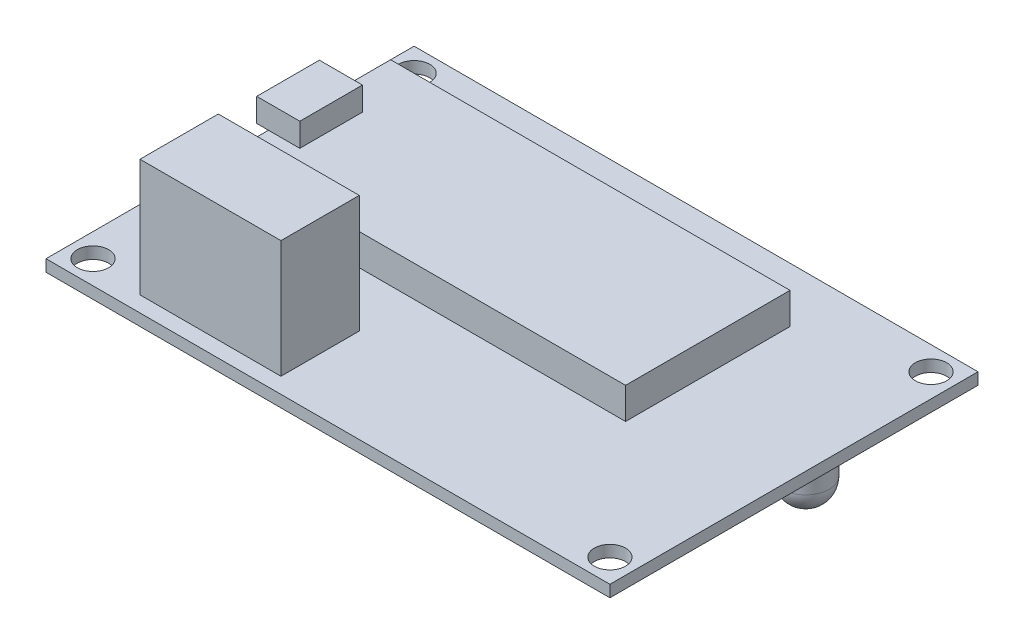
ISO-10303-21;
HEADER;
FILE_DESCRIPTION(('STEP AP214'),'2;1');
FILE_NAME('part.step','',(''),(''),'','','');
FILE_SCHEMA(('AUTOMOTIVE_DESIGN { 1 0 10303 214 1 1 1 1 }'));
ENDSEC;
DATA;
#1=APPLICATION_CONTEXT('core data for automotive mechanical design processes');
#2=APPLICATION_PROTOCOL_DEFINITION('international standard','automotive_design',2000,#1);
#3=PRODUCT_CONTEXT('',#1,'mechanical');
#4=PRODUCT('Part','Part','',(#3));
#5=PRODUCT_RELATED_PRODUCT_CATEGORY('part','',(#4));
#6=PRODUCT_DEFINITION_FORMATION('','',#4);
#7=PRODUCT_DEFINITION_CONTEXT('part definition',#1,'design');
#8=PRODUCT_DEFINITION('design','',#6,#7);
#9=PRODUCT_DEFINITION_SHAPE('','',#8);
#10=(LENGTH_UNIT() NAMED_UNIT(*) SI_UNIT(.MILLI.,.METRE.));
#11=(NAMED_UNIT(*) PLANE_ANGLE_UNIT() SI_UNIT($,.RADIAN.));
#12=(NAMED_UNIT(*) SI_UNIT($,.STERADIAN.) SOLID_ANGLE_UNIT());
#13=UNCERTAINTY_MEASURE_WITH_UNIT(LENGTH_MEASURE(1.E-05),#10,'distance_accuracy_value','');
#14=(GEOMETRIC_REPRESENTATION_CONTEXT(3) GLOBAL_UNCERTAINTY_ASSIGNED_CONTEXT((#13)) GLOBAL_UNIT_ASSIGNED_CONTEXT((#10,
#11,#12)) REPRESENTATION_CONTEXT('',''));
#15=CARTESIAN_POINT('',(0.,0.,0.));
#16=DIRECTION('',(0.,0.,1.));
#17=DIRECTION('',(1.,0.,0.));
#18=AXIS2_PLACEMENT_3D('',#15,#16,#17);
#19=CARTESIAN_POINT('',(0.,5.5,0.));
#20=DIRECTION('',(0.,-1.,0.));
#21=DIRECTION('',(0.,0.,-1.));
#22=AXIS2_PLACEMENT_3D('',#19,#20,#21);
#23=PLANE('',#22);
#24=DIRECTION('',(1.,0.,0.));
#25=VECTOR('',#24,1.);
#26=CARTESIAN_POINT('',(8.,5.5,-24.4062252079966));
#27=LINE('',#26,#25);
#28=CARTESIAN_POINT('',(4.,5.5,-24.4062252079966));
#29=VERTEX_POINT('',#28);
#30=CARTESIAN_POINT('',(8.,5.5,-24.4062252079966));
#31=VERTEX_POINT('',#30);
#32=EDGE_CURVE('E60',#29,#31,#27,.T.);
#33=ORIENTED_EDGE('',*,*,#32,.F.);
#34=DIRECTION('',(0.,0.,1.));
#35=VECTOR('',#34,1.);
#36=CARTESIAN_POINT('',(4.,5.5,-19.));
#37=LINE('',#36,#35);
#38=CARTESIAN_POINT('',(4.,5.5,-19.));
#39=VERTEX_POINT('',#38);
#40=EDGE_CURVE('E210',#29,#39,#37,.T.);
#41=ORIENTED_EDGE('',*,*,#40,.T.);
#42=DIRECTION('',(1.,0.,0.));
#43=VECTOR('',#42,1.);
#44=CARTESIAN_POINT('',(4.,5.5,-19.));
#45=LINE('',#44,#43);
#46=CARTESIAN_POINT('',(55.,5.5,-19.));
#47=VERTEX_POINT('',#46);
#48=EDGE_CURVE('E208',#39,#47,#45,.T.);
#49=ORIENTED_EDGE('',*,*,#48,.T.);
#50=DIRECTION('',(0.,0.,-1.));
#51=VECTOR('',#50,1.);
#52=CARTESIAN_POINT('',(55.,5.5,-19.));
#53=LINE('',#52,#51);
#54=CARTESIAN_POINT('',(55.,5.5,-40.));
#55=VERTEX_POINT('',#54);
#56=EDGE_CURVE('E213',#47,#55,#53,.T.);
#57=ORIENTED_EDGE('',*,*,#56,.T.);
#58=DIRECTION('',(-1.,0.,0.));
#59=VECTOR('',#58,1.);
#60=CARTESIAN_POINT('',(4.,5.5,-40.));
#61=LINE('',#60,#59);
#62=CARTESIAN_POINT('',(4.,5.5,-40.));
#63=VERTEX_POINT('',#62);
#64=EDGE_CURVE('E216',#55,#63,#61,.T.);
#65=ORIENTED_EDGE('',*,*,#64,.T.);
#66=CARTESIAN_POINT('',(4.,5.5,-32.4062252079966));
#67=VERTEX_POINT('',#66);
#68=EDGE_CURVE('E205',#63,#67,#37,.T.);
#69=ORIENTED_EDGE('',*,*,#68,.T.);
#70=DIRECTION('',(-1.,0.,0.));
#71=VECTOR('',#70,1.);
#72=CARTESIAN_POINT('',(8.,5.5,-32.4062252079966));
#73=LINE('',#72,#71);
#74=CARTESIAN_POINT('',(8.,5.5,-32.4062252079966));
#75=VERTEX_POINT('',#74);
#76=EDGE_CURVE('E72',#75,#67,#73,.T.);
#77=ORIENTED_EDGE('',*,*,#76,.F.);
#78=DIRECTION('',(0.,0.,-1.));
#79=VECTOR('',#78,1.);
#80=CARTESIAN_POINT('',(8.,5.5,-32.4062252079966));
#81=LINE('',#80,#79);
#82=EDGE_CURVE('E67',#31,#75,#81,.T.);
#83=ORIENTED_EDGE('',*,*,#82,.F.);
#84=EDGE_LOOP('',(#33,#41,#49,#57,#65,#69,#77,#83));
#85=FACE_BOUND('',#84,.T.);
#86=ADVANCED_FACE('F51',(#85),#23,.F.);
#87=CARTESIAN_POINT('',(0.,1.5,0.));
#88=DIRECTION('',(0.,-1.,0.));
#89=DIRECTION('',(0.,0.,-1.));
#90=AXIS2_PLACEMENT_3D('',#87,#88,#89);
#91=PLANE('',#90);
#92=DIRECTION('',(0.,0.,1.));
#93=VECTOR('',#92,1.);
#94=CARTESIAN_POINT('',(10.,1.5,-2.));
#95=LINE('',#94,#93);
#96=CARTESIAN_POINT('',(10.,1.5,-12.));
#97=VERTEX_POINT('',#96);
#98=CARTESIAN_POINT('',(10.,1.5,-2.));
#99=VERTEX_POINT('',#98);
#100=EDGE_CURVE('E246',#97,#99,#95,.T.);
#101=ORIENTED_EDGE('',*,*,#100,.F.);
#102=DIRECTION('',(-1.,0.,0.));
#103=VECTOR('',#102,1.);
#104=CARTESIAN_POINT('',(10.,1.5,-12.));
#105=LINE('',#104,#103);
#106=CARTESIAN_POINT('',(28.,1.5,-12.));
#107=VERTEX_POINT('',#106);
#108=EDGE_CURVE('E252',#107,#97,#105,.T.);
#109=ORIENTED_EDGE('',*,*,#108,.F.);
#110=DIRECTION('',(0.,0.,-1.));
#111=VECTOR('',#110,1.);
#112=CARTESIAN_POINT('',(28.,1.5,-2.));
#113=LINE('',#112,#111);
#114=CARTESIAN_POINT('',(28.,1.5,-2.));
#115=VERTEX_POINT('',#114);
#116=EDGE_CURVE('E269',#115,#107,#113,.T.);
#117=ORIENTED_EDGE('',*,*,#116,.F.);
#118=DIRECTION('',(1.,0.,0.));
#119=VECTOR('',#118,1.);
#120=CARTESIAN_POINT('',(10.,1.5,-2.));
#121=LINE('',#120,#119);
#122=EDGE_CURVE('E265',#99,#115,#121,.T.);
#123=ORIENTED_EDGE('',*,*,#122,.F.);
#124=EDGE_LOOP('',(#101,#109,#117,#123));
#125=FACE_BOUND('',#124,.T.);
#126=CARTESIAN_POINT('',(2.99999999999999,1.5,-44.));
#127=DIRECTION('',(0.,1.,0.));
#128=DIRECTION('',(0.,0.,1.));
#129=AXIS2_PLACEMENT_3D('',#126,#127,#128);
#130=CIRCLE('',#129,2.);
#131=CARTESIAN_POINT('',(2.99999999999999,1.5,-42.));
#132=VERTEX_POINT('',#131);
#133=EDGE_CURVE('E291',#132,#132,#130,.T.);
#134=ORIENTED_EDGE('',*,*,#133,.F.);
#135=EDGE_LOOP('',(#134));
#136=FACE_BOUND('',#135,.T.);
#137=CARTESIAN_POINT('',(2.99999999999999,1.5,-3.));
#138=DIRECTION('',(0.,1.,0.));
#139=DIRECTION('',(0.,0.,1.));
#140=AXIS2_PLACEMENT_3D('',#137,#138,#139);
#141=CIRCLE('',#140,2.);
#142=CARTESIAN_POINT('',(2.99999999999999,1.5,-0.999999999999995));
#143=VERTEX_POINT('',#142);
#144=EDGE_CURVE('E305',#143,#143,#141,.T.);
#145=ORIENTED_EDGE('',*,*,#144,.F.);
#146=EDGE_LOOP('',(#145));
#147=FACE_BOUND('',#146,.T.);
#148=CARTESIAN_POINT('',(69.,1.5,-3.));
#149=DIRECTION('',(0.,1.,0.));
#150=DIRECTION('',(0.,0.,1.));
#151=AXIS2_PLACEMENT_3D('',#148,#149,#150);
#152=CIRCLE('',#151,2.);
#153=CARTESIAN_POINT('',(69.,1.5,-1.));
#154=VERTEX_POINT('',#153);
#155=EDGE_CURVE('E297',#154,#154,#152,.T.);
#156=ORIENTED_EDGE('',*,*,#155,.F.);
#157=EDGE_LOOP('',(#156));
#158=FACE_BOUND('',#157,.T.);
#159=CARTESIAN_POINT('',(69.,1.5,-44.));
#160=DIRECTION('',(0.,1.,0.));
#161=DIRECTION('',(0.,0.,1.));
#162=AXIS2_PLACEMENT_3D('',#159,#160,#161);
#163=CIRCLE('',#162,2.);
#164=CARTESIAN_POINT('',(69.,1.5,-42.));
#165=VERTEX_POINT('',#164);
#166=EDGE_CURVE('E296',#165,#165,#163,.T.);
#167=ORIENTED_EDGE('',*,*,#166,.F.);
#168=EDGE_LOOP('',(#167));
#169=FACE_BOUND('',#168,.T.);
#170=DIRECTION('',(0.,0.,1.));
#171=VECTOR('',#170,1.);
#172=CARTESIAN_POINT('',(0.,1.5,0.));
#173=LINE('',#172,#171);
#174=CARTESIAN_POINT('',(0.,1.5,-47.));
#175=VERTEX_POINT('',#174);
#176=CARTESIAN_POINT('',(0.,1.5,0.));
#177=VERTEX_POINT('',#176);
#178=EDGE_CURVE('E324',#175,#177,#173,.T.);
#179=ORIENTED_EDGE('',*,*,#178,.T.);
#180=DIRECTION('',(1.,0.,0.));
#181=VECTOR('',#180,1.);
#182=CARTESIAN_POINT('',(0.,1.5,0.));
#183=LINE('',#182,#181);
#184=CARTESIAN_POINT('',(72.,1.5,0.));
#185=VERTEX_POINT('',#184);
#186=EDGE_CURVE('E328',#177,#185,#183,.T.);
#187=ORIENTED_EDGE('',*,*,#186,.T.);
#188=DIRECTION('',(0.,0.,-1.));
#189=VECTOR('',#188,1.);
#190=CARTESIAN_POINT('',(72.,1.5,0.));
#191=LINE('',#190,#189);
#192=CARTESIAN_POINT('',(72.,1.5,-47.));
#193=VERTEX_POINT('',#192);
#194=EDGE_CURVE('E332',#185,#193,#191,.T.);
#195=ORIENTED_EDGE('',*,*,#194,.T.);
#196=DIRECTION('',(-1.,0.,0.));
#197=VECTOR('',#196,1.);
#198=CARTESIAN_POINT('',(0.,1.5,-47.));
#199=LINE('',#198,#197);
#200=EDGE_CURVE('E335',#193,#175,#199,.T.);
#201=ORIENTED_EDGE('',*,*,#200,.T.);
#202=EDGE_LOOP('',(#179,#187,#195,#201));
#203=FACE_BOUND('',#202,.T.);
#204=DIRECTION('',(0.,0.,1.));
#205=VECTOR('',#204,1.);
#206=CARTESIAN_POINT('',(4.,1.5,-19.));
#207=LINE('',#206,#205);
#208=CARTESIAN_POINT('',(4.,1.5,-40.));
#209=VERTEX_POINT('',#208);
#210=CARTESIAN_POINT('',(4.,1.5,-19.));
#211=VERTEX_POINT('',#210);
#212=EDGE_CURVE('E194',#209,#211,#207,.T.);
#213=ORIENTED_EDGE('',*,*,#212,.F.);
#214=DIRECTION('',(-1.,0.,0.));
#215=VECTOR('',#214,1.);
#216=CARTESIAN_POINT('',(4.,1.5,-40.));
#217=LINE('',#216,#215);
#218=CARTESIAN_POINT('',(55.,1.5,-40.));
#219=VERTEX_POINT('',#218);
#220=EDGE_CURVE('E227',#219,#209,#217,.T.);
#221=ORIENTED_EDGE('',*,*,#220,.F.);
#222=DIRECTION('',(0.,0.,-1.));
#223=VECTOR('',#222,1.);
#224=CARTESIAN_POINT('',(55.,1.5,-19.));
#225=LINE('',#224,#223);
#226=CARTESIAN_POINT('',(55.,1.5,-19.));
#227=VERTEX_POINT('',#226);
#228=EDGE_CURVE('E223',#227,#219,#225,.T.);
#229=ORIENTED_EDGE('',*,*,#228,.F.);
#230=DIRECTION('',(1.,0.,0.));
#231=VECTOR('',#230,1.);
#232=CARTESIAN_POINT('',(4.,1.5,-19.));
#233=LINE('',#232,#231);
#234=EDGE_CURVE('E199',#211,#227,#233,.T.);
#235=ORIENTED_EDGE('',*,*,#234,.F.);
#236=EDGE_LOOP('',(#213,#221,#229,#235));
#237=FACE_BOUND('',#236,.T.);
#238=ADVANCED_FACE('F427',(#125,#136,#147,#158,#169,#203,#237),#91,.F.);
#239=CARTESIAN_POINT('',(0.,1.5,0.));
#240=DIRECTION('',(1.,0.,0.));
#241=DIRECTION('',(0.,0.,-1.));
#242=AXIS2_PLACEMENT_3D('',#239,#240,#241);
#243=PLANE('',#242);
#244=DIRECTION('',(0.,0.,1.));
#245=VECTOR('',#244,1.);
#246=CARTESIAN_POINT('',(0.,0.,0.));
#247=LINE('',#246,#245);
#248=CARTESIAN_POINT('',(0.,0.,-47.));
#249=VERTEX_POINT('',#248);
#250=CARTESIAN_POINT('',(0.,0.,0.));
#251=VERTEX_POINT('',#250);
#252=EDGE_CURVE('E320',#249,#251,#247,.T.);
#253=ORIENTED_EDGE('',*,*,#252,.T.);
#254=DIRECTION('',(0.,-1.,0.));
#255=VECTOR('',#254,1.);
#256=CARTESIAN_POINT('',(0.,1.5,0.));
#257=LINE('',#256,#255);
#258=EDGE_CURVE('E360',#177,#251,#257,.T.);
#259=ORIENTED_EDGE('',*,*,#258,.F.);
#260=ORIENTED_EDGE('',*,*,#178,.F.);
#261=DIRECTION('',(0.,-1.,0.));
#262=VECTOR('',#261,1.);
#263=CARTESIAN_POINT('',(0.,1.5,-47.));
#264=LINE('',#263,#262);
#265=EDGE_CURVE('E338',#175,#249,#264,.T.);
#266=ORIENTED_EDGE('',*,*,#265,.T.);
#267=EDGE_LOOP('',(#253,#259,#260,#266));
#268=FACE_BOUND('',#267,.T.);
#269=ADVANCED_FACE('F415',(#268),#243,.F.);
#270=CARTESIAN_POINT('',(0.,1.5,0.));
#271=DIRECTION('',(0.,0.,-1.));
#272=DIRECTION('',(-1.,0.,0.));
#273=AXIS2_PLACEMENT_3D('',#270,#271,#272);
#274=PLANE('',#273);
#275=DIRECTION('',(1.,0.,0.));
#276=VECTOR('',#275,1.);
#277=CARTESIAN_POINT('',(0.,0.,0.));
#278=LINE('',#277,#276);
#279=CARTESIAN_POINT('',(72.,0.,0.));
#280=VERTEX_POINT('',#279);
#281=EDGE_CURVE('E342',#251,#280,#278,.T.);
#282=ORIENTED_EDGE('',*,*,#281,.T.);
#283=DIRECTION('',(0.,-1.,0.));
#284=VECTOR('',#283,1.);
#285=CARTESIAN_POINT('',(72.,1.5,0.));
#286=LINE('',#285,#284);
#287=EDGE_CURVE('E357',#185,#280,#286,.T.);
#288=ORIENTED_EDGE('',*,*,#287,.F.);
#289=ORIENTED_EDGE('',*,*,#186,.F.);
#290=ORIENTED_EDGE('',*,*,#258,.T.);
#291=EDGE_LOOP('',(#282,#288,#289,#290));
#292=FACE_BOUND('',#291,.T.);
#293=ADVANCED_FACE('F425',(#292),#274,.F.);
#294=CARTESIAN_POINT('',(72.,1.5,0.));
#295=DIRECTION('',(-1.,0.,0.));
#296=DIRECTION('',(0.,0.,1.));
#297=AXIS2_PLACEMENT_3D('',#294,#295,#296);
#298=PLANE('',#297);
#299=DIRECTION('',(0.,0.,-1.));
#300=VECTOR('',#299,1.);
#301=CARTESIAN_POINT('',(72.,0.,0.));
#302=LINE('',#301,#300);
#303=CARTESIAN_POINT('',(72.,0.,-47.));
#304=VERTEX_POINT('',#303);
#305=EDGE_CURVE('E345',#280,#304,#302,.T.);
#306=ORIENTED_EDGE('',*,*,#305,.T.);
#307=DIRECTION('',(0.,-1.,0.));
#308=VECTOR('',#307,1.);
#309=CARTESIAN_POINT('',(72.,1.5,-47.));
#310=LINE('',#309,#308);
#311=EDGE_CURVE('E353',#193,#304,#310,.T.);
#312=ORIENTED_EDGE('',*,*,#311,.F.);
#313=ORIENTED_EDGE('',*,*,#194,.F.);
#314=ORIENTED_EDGE('',*,*,#287,.T.);
#315=EDGE_LOOP('',(#306,#312,#313,#314));
#316=FACE_BOUND('',#315,.T.);
#317=ADVANCED_FACE('F423',(#316),#298,.F.);
#318=CARTESIAN_POINT('',(0.,1.5,-47.));
#319=DIRECTION('',(0.,0.,1.));
#320=DIRECTION('',(1.,0.,0.));
#321=AXIS2_PLACEMENT_3D('',#318,#319,#320);
#322=PLANE('',#321);
#323=DIRECTION('',(-1.,0.,0.));
#324=VECTOR('',#323,1.);
#325=CARTESIAN_POINT('',(0.,0.,-47.));
#326=LINE('',#325,#324);
#327=EDGE_CURVE('E329',#304,#249,#326,.T.);
#328=ORIENTED_EDGE('',*,*,#327,.T.);
#329=ORIENTED_EDGE('',*,*,#265,.F.);
#330=ORIENTED_EDGE('',*,*,#200,.F.);
#331=ORIENTED_EDGE('',*,*,#311,.T.);
#332=EDGE_LOOP('',(#328,#329,#330,#331));
#333=FACE_BOUND('',#332,.T.);
#334=ADVANCED_FACE('F401',(#333),#322,.F.);
#335=CARTESIAN_POINT('',(0.,0.,0.));
#336=DIRECTION('',(0.,-1.,0.));
#337=DIRECTION('',(0.,0.,-1.));
#338=AXIS2_PLACEMENT_3D('',#335,#336,#337);
#339=PLANE('',#338);
#340=CARTESIAN_POINT('',(58.,0.,-39.));
#341=DIRECTION('',(0.,-1.,0.));
#342=DIRECTION('',(0.,0.,-1.));
#343=AXIS2_PLACEMENT_3D('',#340,#341,#342);
#344=CIRCLE('',#343,3.);
#345=CARTESIAN_POINT('',(58.,0.,-42.));
#346=VERTEX_POINT('',#345);
#347=EDGE_CURVE('E385',#346,#346,#344,.T.);
#348=ORIENTED_EDGE('',*,*,#347,.F.);
#349=EDGE_LOOP('',(#348));
#350=FACE_BOUND('',#349,.T.);
#351=CARTESIAN_POINT('',(2.99999999999999,0.,-44.));
#352=DIRECTION('',(0.,1.,0.));
#353=DIRECTION('',(0.,0.,1.));
#354=AXIS2_PLACEMENT_3D('',#351,#352,#353);
#355=CIRCLE('',#354,2.);
#356=CARTESIAN_POINT('',(2.99999999999999,0.,-42.));
#357=VERTEX_POINT('',#356);
#358=EDGE_CURVE('E309',#357,#357,#355,.T.);
#359=ORIENTED_EDGE('',*,*,#358,.T.);
#360=EDGE_LOOP('',(#359));
#361=FACE_BOUND('',#360,.T.);
#362=CARTESIAN_POINT('',(2.99999999999999,0.,-3.));
#363=DIRECTION('',(0.,1.,0.));
#364=DIRECTION('',(0.,0.,1.));
#365=AXIS2_PLACEMENT_3D('',#362,#363,#364);
#366=CIRCLE('',#365,2.);
#367=CARTESIAN_POINT('',(2.99999999999999,0.,-0.999999999999995));
#368=VERTEX_POINT('',#367);
#369=EDGE_CURVE('E301',#368,#368,#366,.T.);
#370=ORIENTED_EDGE('',*,*,#369,.T.);
#371=EDGE_LOOP('',(#370));
#372=FACE_BOUND('',#371,.T.);
#373=CARTESIAN_POINT('',(69.,0.,-3.));
#374=DIRECTION('',(0.,1.,0.));
#375=DIRECTION('',(0.,0.,1.));
#376=AXIS2_PLACEMENT_3D('',#373,#374,#375);
#377=CIRCLE('',#376,2.);
#378=CARTESIAN_POINT('',(69.,0.,-1.));
#379=VERTEX_POINT('',#378);
#380=EDGE_CURVE('E292',#379,#379,#377,.T.);
#381=ORIENTED_EDGE('',*,*,#380,.T.);
#382=EDGE_LOOP('',(#381));
#383=FACE_BOUND('',#382,.T.);
#384=CARTESIAN_POINT('',(69.,0.,-44.));
#385=DIRECTION('',(0.,1.,0.));
#386=DIRECTION('',(0.,0.,1.));
#387=AXIS2_PLACEMENT_3D('',#384,#385,#386);
#388=CIRCLE('',#387,2.);
#389=CARTESIAN_POINT('',(69.,0.,-42.));
#390=VERTEX_POINT('',#389);
#391=EDGE_CURVE('E316',#390,#390,#388,.T.);
#392=ORIENTED_EDGE('',*,*,#391,.T.);
#393=EDGE_LOOP('',(#392));
#394=FACE_BOUND('',#393,.T.);
#395=ORIENTED_EDGE('',*,*,#252,.F.);
#396=ORIENTED_EDGE('',*,*,#327,.F.);
#397=ORIENTED_EDGE('',*,*,#305,.F.);
#398=ORIENTED_EDGE('',*,*,#281,.F.);
#399=EDGE_LOOP('',(#395,#396,#397,#398));
#400=FACE_BOUND('',#399,.T.);
#401=ADVANCED_FACE('F397',(#350,#361,#372,#383,#394,#400),#339,.T.);
#402=CARTESIAN_POINT('',(69.,0.,-44.));
#403=DIRECTION('',(0.,1.,0.));
#404=DIRECTION('',(0.,0.,1.));
#405=AXIS2_PLACEMENT_3D('',#402,#403,#404);
#406=CYLINDRICAL_SURFACE('',#405,2.);
#407=ORIENTED_EDGE('',*,*,#391,.F.);
#408=EDGE_LOOP('',(#407));
#409=FACE_BOUND('',#408,.T.);
#410=ORIENTED_EDGE('',*,*,#166,.T.);
#411=EDGE_LOOP('',(#410));
#412=FACE_BOUND('',#411,.T.);
#413=ADVANCED_FACE('F400',(#409,#412),#406,.F.);
#414=CARTESIAN_POINT('',(69.,0.,-3.));
#415=DIRECTION('',(0.,1.,0.));
#416=DIRECTION('',(0.,0.,1.));
#417=AXIS2_PLACEMENT_3D('',#414,#415,#416);
#418=CYLINDRICAL_SURFACE('',#417,2.);
#419=ORIENTED_EDGE('',*,*,#380,.F.);
#420=EDGE_LOOP('',(#419));
#421=FACE_BOUND('',#420,.T.);
#422=ORIENTED_EDGE('',*,*,#155,.T.);
#423=EDGE_LOOP('',(#422));
#424=FACE_BOUND('',#423,.T.);
#425=ADVANCED_FACE('F507',(#421,#424),#418,.F.);
#426=CARTESIAN_POINT('',(2.99999999999999,0.,-3.));
#427=DIRECTION('',(0.,1.,0.));
#428=DIRECTION('',(0.,0.,1.));
#429=AXIS2_PLACEMENT_3D('',#426,#427,#428);
#430=CYLINDRICAL_SURFACE('',#429,2.);
#431=ORIENTED_EDGE('',*,*,#369,.F.);
#432=EDGE_LOOP('',(#431));
#433=FACE_BOUND('',#432,.T.);
#434=ORIENTED_EDGE('',*,*,#144,.T.);
#435=EDGE_LOOP('',(#434));
#436=FACE_BOUND('',#435,.T.);
#437=ADVANCED_FACE('F510',(#433,#436),#430,.F.);
#438=CARTESIAN_POINT('',(2.99999999999999,0.,-44.));
#439=DIRECTION('',(0.,1.,0.));
#440=DIRECTION('',(0.,0.,1.));
#441=AXIS2_PLACEMENT_3D('',#438,#439,#440);
#442=CYLINDRICAL_SURFACE('',#441,2.);
#443=ORIENTED_EDGE('',*,*,#358,.F.);
#444=EDGE_LOOP('',(#443));
#445=FACE_BOUND('',#444,.T.);
#446=ORIENTED_EDGE('',*,*,#133,.T.);
#447=EDGE_LOOP('',(#446));
#448=FACE_BOUND('',#447,.T.);
#449=ADVANCED_FACE('F505',(#445,#448),#442,.F.);
#450=CARTESIAN_POINT('',(10.,16.5,-2.));
#451=DIRECTION('',(1.,0.,0.));
#452=DIRECTION('',(0.,0.,-1.));
#453=AXIS2_PLACEMENT_3D('',#450,#451,#452);
#454=PLANE('',#453);
#455=ORIENTED_EDGE('',*,*,#100,.T.);
#456=DIRECTION('',(0.,-1.,0.));
#457=VECTOR('',#456,1.);
#458=CARTESIAN_POINT('',(10.,16.5,-2.));
#459=LINE('',#458,#457);
#460=CARTESIAN_POINT('',(10.,16.5,-2.));
#461=VERTEX_POINT('',#460);
#462=EDGE_CURVE('E287',#461,#99,#459,.T.);
#463=ORIENTED_EDGE('',*,*,#462,.F.);
#464=DIRECTION('',(0.,0.,1.));
#465=VECTOR('',#464,1.);
#466=CARTESIAN_POINT('',(10.,16.5,-2.));
#467=LINE('',#466,#465);
#468=CARTESIAN_POINT('',(10.,16.5,-12.));
#469=VERTEX_POINT('',#468);
#470=EDGE_CURVE('E247',#469,#461,#467,.T.);
#471=ORIENTED_EDGE('',*,*,#470,.F.);
#472=DIRECTION('',(0.,-1.,0.));
#473=VECTOR('',#472,1.);
#474=CARTESIAN_POINT('',(10.,16.5,-12.));
#475=LINE('',#474,#473);
#476=EDGE_CURVE('E261',#469,#97,#475,.T.);
#477=ORIENTED_EDGE('',*,*,#476,.T.);
#478=EDGE_LOOP('',(#455,#463,#471,#477));
#479=FACE_BOUND('',#478,.T.);
#480=ADVANCED_FACE('F501',(#479),#454,.F.);
#481=CARTESIAN_POINT('',(10.,16.5,-2.));
#482=DIRECTION('',(0.,0.,-1.));
#483=DIRECTION('',(-1.,0.,0.));
#484=AXIS2_PLACEMENT_3D('',#481,#482,#483);
#485=PLANE('',#484);
#486=ORIENTED_EDGE('',*,*,#122,.T.);
#487=DIRECTION('',(0.,-1.,0.));
#488=VECTOR('',#487,1.);
#489=CARTESIAN_POINT('',(28.,16.5,-2.));
#490=LINE('',#489,#488);
#491=CARTESIAN_POINT('',(28.,16.5,-2.));
#492=VERTEX_POINT('',#491);
#493=EDGE_CURVE('E283',#492,#115,#490,.T.);
#494=ORIENTED_EDGE('',*,*,#493,.F.);
#495=DIRECTION('',(1.,0.,0.));
#496=VECTOR('',#495,1.);
#497=CARTESIAN_POINT('',(10.,16.5,-2.));
#498=LINE('',#497,#496);
#499=EDGE_CURVE('E251',#461,#492,#498,.T.);
#500=ORIENTED_EDGE('',*,*,#499,.F.);
#501=ORIENTED_EDGE('',*,*,#462,.T.);
#502=EDGE_LOOP('',(#486,#494,#500,#501));
#503=FACE_BOUND('',#502,.T.);
#504=ADVANCED_FACE('F497',(#503),#485,.F.);
#505=CARTESIAN_POINT('',(28.,16.5,-2.));
#506=DIRECTION('',(-1.,0.,0.));
#507=DIRECTION('',(0.,0.,1.));
#508=AXIS2_PLACEMENT_3D('',#505,#506,#507);
#509=PLANE('',#508);
#510=ORIENTED_EDGE('',*,*,#116,.T.);
#511=DIRECTION('',(0.,-1.,0.));
#512=VECTOR('',#511,1.);
#513=CARTESIAN_POINT('',(28.,16.5,-12.));
#514=LINE('',#513,#512);
#515=CARTESIAN_POINT('',(28.,16.5,-12.));
#516=VERTEX_POINT('',#515);
#517=EDGE_CURVE('E279',#516,#107,#514,.T.);
#518=ORIENTED_EDGE('',*,*,#517,.F.);
#519=DIRECTION('',(0.,0.,-1.));
#520=VECTOR('',#519,1.);
#521=CARTESIAN_POINT('',(28.,16.5,-2.));
#522=LINE('',#521,#520);
#523=EDGE_CURVE('E255',#492,#516,#522,.T.);
#524=ORIENTED_EDGE('',*,*,#523,.F.);
#525=ORIENTED_EDGE('',*,*,#493,.T.);
#526=EDGE_LOOP('',(#510,#518,#524,#525));
#527=FACE_BOUND('',#526,.T.);
#528=ADVANCED_FACE('F493',(#527),#509,.F.);
#529=CARTESIAN_POINT('',(10.,16.5,-12.));
#530=DIRECTION('',(0.,0.,1.));
#531=DIRECTION('',(1.,0.,0.));
#532=AXIS2_PLACEMENT_3D('',#529,#530,#531);
#533=PLANE('',#532);
#534=ORIENTED_EDGE('',*,*,#108,.T.);
#535=ORIENTED_EDGE('',*,*,#476,.F.);
#536=DIRECTION('',(-1.,0.,0.));
#537=VECTOR('',#536,1.);
#538=CARTESIAN_POINT('',(10.,16.5,-12.));
#539=LINE('',#538,#537);
#540=EDGE_CURVE('E258',#516,#469,#539,.T.);
#541=ORIENTED_EDGE('',*,*,#540,.F.);
#542=ORIENTED_EDGE('',*,*,#517,.T.);
#543=EDGE_LOOP('',(#534,#535,#541,#542));
#544=FACE_BOUND('',#543,.T.);
#545=ADVANCED_FACE('F489',(#544),#533,.F.);
#546=CARTESIAN_POINT('',(0.,16.5,0.));
#547=DIRECTION('',(0.,-1.,0.));
#548=DIRECTION('',(0.,0.,-1.));
#549=AXIS2_PLACEMENT_3D('',#546,#547,#548);
#550=PLANE('',#549);
#551=ORIENTED_EDGE('',*,*,#470,.T.);
#552=ORIENTED_EDGE('',*,*,#499,.T.);
#553=ORIENTED_EDGE('',*,*,#523,.T.);
#554=ORIENTED_EDGE('',*,*,#540,.T.);
#555=EDGE_LOOP('',(#551,#552,#553,#554));
#556=FACE_BOUND('',#555,.T.);
#557=ADVANCED_FACE('F486',(#556),#550,.F.);
#558=CARTESIAN_POINT('',(4.,5.5,-19.));
#559=DIRECTION('',(1.,0.,0.));
#560=DIRECTION('',(0.,0.,-1.));
#561=AXIS2_PLACEMENT_3D('',#558,#559,#560);
#562=PLANE('',#561);
#563=ORIENTED_EDGE('',*,*,#212,.T.);
#564=DIRECTION('',(0.,-1.,0.));
#565=VECTOR('',#564,1.);
#566=CARTESIAN_POINT('',(4.,5.5,-19.));
#567=LINE('',#566,#565);
#568=EDGE_CURVE('E242',#39,#211,#567,.T.);
#569=ORIENTED_EDGE('',*,*,#568,.F.);
#570=ORIENTED_EDGE('',*,*,#40,.F.);
#571=EDGE_CURVE('E209',#67,#29,#37,.T.);
#572=ORIENTED_EDGE('',*,*,#571,.F.);
#573=ORIENTED_EDGE('',*,*,#68,.F.);
#574=DIRECTION('',(0.,-1.,0.));
#575=VECTOR('',#574,1.);
#576=CARTESIAN_POINT('',(4.,5.5,-40.));
#577=LINE('',#576,#575);
#578=EDGE_CURVE('E218',#63,#209,#577,.T.);
#579=ORIENTED_EDGE('',*,*,#578,.T.);
#580=EDGE_LOOP('',(#563,#569,#570,#572,#573,#579));
#581=FACE_BOUND('',#580,.T.);
#582=ADVANCED_FACE('F440',(#581),#562,.F.);
#583=CARTESIAN_POINT('',(4.,5.5,-19.));
#584=DIRECTION('',(0.,0.,-1.));
#585=DIRECTION('',(-1.,0.,0.));
#586=AXIS2_PLACEMENT_3D('',#583,#584,#585);
#587=PLANE('',#586);
#588=ORIENTED_EDGE('',*,*,#234,.T.);
#589=DIRECTION('',(0.,-1.,0.));
#590=VECTOR('',#589,1.);
#591=CARTESIAN_POINT('',(55.,5.5,-19.));
#592=LINE('',#591,#590);
#593=EDGE_CURVE('E238',#47,#227,#592,.T.);
#594=ORIENTED_EDGE('',*,*,#593,.F.);
#595=ORIENTED_EDGE('',*,*,#48,.F.);
#596=ORIENTED_EDGE('',*,*,#568,.T.);
#597=EDGE_LOOP('',(#588,#594,#595,#596));
#598=FACE_BOUND('',#597,.T.);
#599=ADVANCED_FACE('F451',(#598),#587,.F.);
#600=CARTESIAN_POINT('',(55.,5.5,-19.));
#601=DIRECTION('',(-1.,0.,0.));
#602=DIRECTION('',(0.,0.,1.));
#603=AXIS2_PLACEMENT_3D('',#600,#601,#602);
#604=PLANE('',#603);
#605=ORIENTED_EDGE('',*,*,#228,.T.);
#606=DIRECTION('',(0.,-1.,0.));
#607=VECTOR('',#606,1.);
#608=CARTESIAN_POINT('',(55.,5.5,-40.));
#609=LINE('',#608,#607);
#610=EDGE_CURVE('E234',#55,#219,#609,.T.);
#611=ORIENTED_EDGE('',*,*,#610,.F.);
#612=ORIENTED_EDGE('',*,*,#56,.F.);
#613=ORIENTED_EDGE('',*,*,#593,.T.);
#614=EDGE_LOOP('',(#605,#611,#612,#613));
#615=FACE_BOUND('',#614,.T.);
#616=ADVANCED_FACE('F449',(#615),#604,.F.);
#617=CARTESIAN_POINT('',(4.,5.5,-40.));
#618=DIRECTION('',(0.,0.,1.));
#619=DIRECTION('',(1.,0.,0.));
#620=AXIS2_PLACEMENT_3D('',#617,#618,#619);
#621=PLANE('',#620);
#622=ORIENTED_EDGE('',*,*,#220,.T.);
#623=ORIENTED_EDGE('',*,*,#578,.F.);
#624=ORIENTED_EDGE('',*,*,#64,.F.);
#625=ORIENTED_EDGE('',*,*,#610,.T.);
#626=EDGE_LOOP('',(#622,#623,#624,#625));
#627=FACE_BOUND('',#626,.T.);
#628=ADVANCED_FACE('F436',(#627),#621,.F.);
#629=CARTESIAN_POINT('',(8.,8.5,-32.4062252079966));
#630=DIRECTION('',(-1.,0.,0.));
#631=DIRECTION('',(0.,0.,1.));
#632=AXIS2_PLACEMENT_3D('',#629,#630,#631);
#633=PLANE('',#632);
#634=ORIENTED_EDGE('',*,*,#82,.T.);
#635=DIRECTION('',(0.,-1.,0.));
#636=VECTOR('',#635,1.);
#637=CARTESIAN_POINT('',(8.,8.5,-32.4062252079966));
#638=LINE('',#637,#636);
#639=CARTESIAN_POINT('',(8.,8.5,-32.4062252079966));
#640=VERTEX_POINT('',#639);
#641=EDGE_CURVE('E173',#640,#75,#638,.T.);
#642=ORIENTED_EDGE('',*,*,#641,.F.);
#643=DIRECTION('',(0.,0.,-1.));
#644=VECTOR('',#643,1.);
#645=CARTESIAN_POINT('',(8.,8.5,-32.4062252079966));
#646=LINE('',#645,#644);
#647=CARTESIAN_POINT('',(8.,8.5,-24.4062252079966));
#648=VERTEX_POINT('',#647);
#649=EDGE_CURVE('E180',#648,#640,#646,.T.);
#650=ORIENTED_EDGE('',*,*,#649,.F.);
#651=DIRECTION('',(0.,-1.,0.));
#652=VECTOR('',#651,1.);
#653=CARTESIAN_POINT('',(8.,8.5,-24.4062252079966));
#654=LINE('',#653,#652);
#655=EDGE_CURVE('E388',#648,#31,#654,.T.);
#656=ORIENTED_EDGE('',*,*,#655,.T.);
#657=EDGE_LOOP('',(#634,#642,#650,#656));
#658=FACE_BOUND('',#657,.T.);
#659=ADVANCED_FACE('F192',(#658),#633,.F.);
#660=CARTESIAN_POINT('',(8.,8.5,-32.4062252079966));
#661=DIRECTION('',(0.,0.,1.));
#662=DIRECTION('',(1.,0.,0.));
#663=AXIS2_PLACEMENT_3D('',#660,#661,#662);
#664=PLANE('',#663);
#665=ORIENTED_EDGE('',*,*,#76,.T.);
#666=CARTESIAN_POINT('',(2.5,5.5,-32.4062252079966));
#667=VERTEX_POINT('',#666);
#668=EDGE_CURVE('E380',#67,#667,#73,.T.);
#669=ORIENTED_EDGE('',*,*,#668,.T.);
#670=DIRECTION('',(0.,-1.,0.));
#671=VECTOR('',#670,1.);
#672=CARTESIAN_POINT('',(2.5,8.5,-32.4062252079966));
#673=LINE('',#672,#671);
#674=CARTESIAN_POINT('',(2.5,8.5,-32.4062252079966));
#675=VERTEX_POINT('',#674);
#676=EDGE_CURVE('E175',#675,#667,#673,.T.);
#677=ORIENTED_EDGE('',*,*,#676,.F.);
#678=DIRECTION('',(-1.,0.,0.));
#679=VECTOR('',#678,1.);
#680=CARTESIAN_POINT('',(8.,8.5,-32.4062252079966));
#681=LINE('',#680,#679);
#682=EDGE_CURVE('E169',#640,#675,#681,.T.);
#683=ORIENTED_EDGE('',*,*,#682,.F.);
#684=ORIENTED_EDGE('',*,*,#641,.T.);
#685=EDGE_LOOP('',(#665,#669,#677,#683,#684));
#686=FACE_BOUND('',#685,.T.);
#687=ADVANCED_FACE('F171',(#686),#664,.F.);
#688=CARTESIAN_POINT('',(2.5,8.5,-32.4062252079966));
#689=DIRECTION('',(1.,0.,0.));
#690=DIRECTION('',(0.,0.,-1.));
#691=AXIS2_PLACEMENT_3D('',#688,#689,#690);
#692=PLANE('',#691);
#693=DIRECTION('',(0.,0.,1.));
#694=VECTOR('',#693,1.);
#695=CARTESIAN_POINT('',(2.5,5.5,-32.4062252079966));
#696=LINE('',#695,#694);
#697=CARTESIAN_POINT('',(2.5,5.5,-24.4062252079966));
#698=VERTEX_POINT('',#697);
#699=EDGE_CURVE('E372',#667,#698,#696,.T.);
#700=ORIENTED_EDGE('',*,*,#699,.T.);
#701=DIRECTION('',(0.,-1.,0.));
#702=VECTOR('',#701,1.);
#703=CARTESIAN_POINT('',(2.5,8.5,-24.4062252079966));
#704=LINE('',#703,#702);
#705=CARTESIAN_POINT('',(2.5,8.5,-24.4062252079966));
#706=VERTEX_POINT('',#705);
#707=EDGE_CURVE('E201',#706,#698,#704,.T.);
#708=ORIENTED_EDGE('',*,*,#707,.F.);
#709=DIRECTION('',(0.,0.,1.));
#710=VECTOR('',#709,1.);
#711=CARTESIAN_POINT('',(2.5,8.5,-32.4062252079966));
#712=LINE('',#711,#710);
#713=EDGE_CURVE('E179',#675,#706,#712,.T.);
#714=ORIENTED_EDGE('',*,*,#713,.F.);
#715=ORIENTED_EDGE('',*,*,#676,.T.);
#716=EDGE_LOOP('',(#700,#708,#714,#715));
#717=FACE_BOUND('',#716,.T.);
#718=ADVANCED_FACE('F457',(#717),#692,.F.);
#719=CARTESIAN_POINT('',(8.,8.5,-24.4062252079966));
#720=DIRECTION('',(0.,0.,-1.));
#721=DIRECTION('',(-1.,0.,0.));
#722=AXIS2_PLACEMENT_3D('',#719,#720,#721);
#723=PLANE('',#722);
#724=EDGE_CURVE('E190',#698,#29,#27,.T.);
#725=ORIENTED_EDGE('',*,*,#724,.T.);
#726=ORIENTED_EDGE('',*,*,#32,.T.);
#727=ORIENTED_EDGE('',*,*,#655,.F.);
#728=DIRECTION('',(1.,0.,0.));
#729=VECTOR('',#728,1.);
#730=CARTESIAN_POINT('',(8.,8.5,-24.4062252079966));
#731=LINE('',#730,#729);
#732=EDGE_CURVE('E185',#706,#648,#731,.T.);
#733=ORIENTED_EDGE('',*,*,#732,.F.);
#734=ORIENTED_EDGE('',*,*,#707,.T.);
#735=EDGE_LOOP('',(#725,#726,#727,#733,#734));
#736=FACE_BOUND('',#735,.T.);
#737=ADVANCED_FACE('F459',(#736),#723,.F.);
#738=CARTESIAN_POINT('',(0.,8.5,0.));
#739=DIRECTION('',(0.,-1.,0.));
#740=DIRECTION('',(0.,0.,-1.));
#741=AXIS2_PLACEMENT_3D('',#738,#739,#740);
#742=PLANE('',#741);
#743=ORIENTED_EDGE('',*,*,#649,.T.);
#744=ORIENTED_EDGE('',*,*,#682,.T.);
#745=ORIENTED_EDGE('',*,*,#713,.T.);
#746=ORIENTED_EDGE('',*,*,#732,.T.);
#747=EDGE_LOOP('',(#743,#744,#745,#746));
#748=FACE_BOUND('',#747,.T.);
#749=ADVANCED_FACE('F183',(#748),#742,.F.);
#750=CARTESIAN_POINT('',(0.,5.5,0.));
#751=DIRECTION('',(0.,-1.,0.));
#752=DIRECTION('',(0.,0.,-1.));
#753=AXIS2_PLACEMENT_3D('',#750,#751,#752);
#754=PLANE('',#753);
#755=ORIENTED_EDGE('',*,*,#668,.F.);
#756=ORIENTED_EDGE('',*,*,#571,.T.);
#757=ORIENTED_EDGE('',*,*,#724,.F.);
#758=ORIENTED_EDGE('',*,*,#699,.F.);
#759=EDGE_LOOP('',(#755,#756,#757,#758));
#760=FACE_BOUND('',#759,.T.);
#761=ADVANCED_FACE('F454',(#760),#754,.T.);
#762=CARTESIAN_POINT('',(58.,-16.,-39.));
#763=DIRECTION('',(0.,1.,0.));
#764=DIRECTION('',(0.,0.,1.));
#765=AXIS2_PLACEMENT_3D('',#762,#763,#764);
#766=CYLINDRICAL_SURFACE('',#765,3.);
#767=CARTESIAN_POINT('',(58.,-13.,-39.));
#768=DIRECTION('',(0.,1.,0.));
#769=DIRECTION('',(0.,0.,1.));
#770=AXIS2_PLACEMENT_3D('',#767,#768,#769);
#771=CIRCLE('',#770,3.);
#772=CARTESIAN_POINT('',(58.,-13.,-36.));
#773=VERTEX_POINT('',#772);
#774=EDGE_CURVE('E11',#773,#773,#771,.T.);
#775=ORIENTED_EDGE('',*,*,#774,.T.);
#776=EDGE_LOOP('',(#775));
#777=FACE_BOUND('',#776,.T.);
#778=ORIENTED_EDGE('',*,*,#347,.T.);
#779=EDGE_LOOP('',(#778));
#780=FACE_BOUND('',#779,.T.);
#781=ADVANCED_FACE('F395',(#777,#780),#766,.T.);
#782=CARTESIAN_POINT('',(58.,-13.,-39.));
#783=DIRECTION('',(0.,-1.,0.));
#784=DIRECTION('',(0.,0.,-1.));
#785=AXIS2_PLACEMENT_3D('',#782,#783,#784);
#786=SPHERICAL_SURFACE('',#785,3.);
#787=ORIENTED_EDGE('',*,*,#774,.F.);
#788=EDGE_LOOP('',(#787));
#789=FACE_BOUND('',#788,.T.);
#790=ADVANCED_FACE('F53',(#789),#786,.T.);
#791=CLOSED_SHELL('',(#86,#238,#269,#293,#317,#334,#401,#413,#425,#437,#449,#480,#504,#528,#545,
#557,#582,#599,#616,#628,#659,#687,#718,#737,#749,#761,#781,#790));
#792=MANIFOLD_SOLID_BREP('B2',#791);
#793=ADVANCED_BREP_SHAPE_REPRESENTATION('',(#18,#792),#14);
#794=SHAPE_DEFINITION_REPRESENTATION(#9,#793);
ENDSEC;
END-ISO-10303-21;
